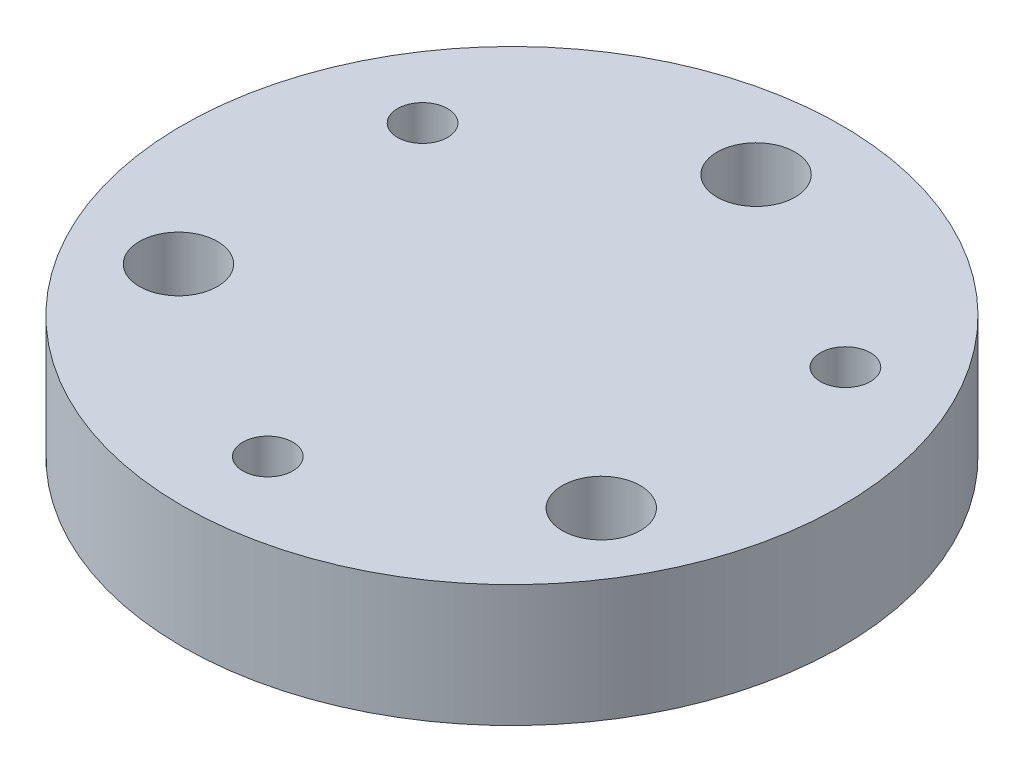
ISO-10303-21;
HEADER;
FILE_DESCRIPTION(('STEP AP214'),'2;1');
FILE_NAME('part.step','',(''),(''),'','','');
FILE_SCHEMA(('AUTOMOTIVE_DESIGN { 1 0 10303 214 1 1 1 1 }'));
ENDSEC;
DATA;
#1=APPLICATION_CONTEXT('core data for automotive mechanical design processes');
#2=APPLICATION_PROTOCOL_DEFINITION('international standard','automotive_design',2000,#1);
#3=PRODUCT_CONTEXT('',#1,'mechanical');
#4=PRODUCT('Part','Part','',(#3));
#5=PRODUCT_RELATED_PRODUCT_CATEGORY('part','',(#4));
#6=PRODUCT_DEFINITION_FORMATION('','',#4);
#7=PRODUCT_DEFINITION_CONTEXT('part definition',#1,'design');
#8=PRODUCT_DEFINITION('design','',#6,#7);
#9=PRODUCT_DEFINITION_SHAPE('','',#8);
#10=(LENGTH_UNIT() NAMED_UNIT(*) SI_UNIT(.MILLI.,.METRE.));
#11=(NAMED_UNIT(*) PLANE_ANGLE_UNIT() SI_UNIT($,.RADIAN.));
#12=(NAMED_UNIT(*) SI_UNIT($,.STERADIAN.) SOLID_ANGLE_UNIT());
#13=UNCERTAINTY_MEASURE_WITH_UNIT(LENGTH_MEASURE(1.E-05),#10,'distance_accuracy_value','');
#14=(GEOMETRIC_REPRESENTATION_CONTEXT(3) GLOBAL_UNCERTAINTY_ASSIGNED_CONTEXT((#13)) GLOBAL_UNIT_ASSIGNED_CONTEXT((#10,
#11,#12)) REPRESENTATION_CONTEXT('',''));
#15=CARTESIAN_POINT('',(0.,0.,0.));
#16=DIRECTION('',(0.,0.,1.));
#17=DIRECTION('',(1.,0.,0.));
#18=AXIS2_PLACEMENT_3D('',#15,#16,#17);
#19=CARTESIAN_POINT('',(0.,5.,0.));
#20=DIRECTION('',(0.,1.,0.));
#21=DIRECTION('',(0.,0.,1.));
#22=AXIS2_PLACEMENT_3D('',#19,#20,#21);
#23=PLANE('',#22);
#24=CARTESIAN_POINT('',(0.,5.,10.));
#25=DIRECTION('',(0.,1.,0.));
#26=DIRECTION('',(0.,0.,1.));
#27=AXIS2_PLACEMENT_3D('',#24,#25,#26);
#28=CIRCLE('',#27,1.025);
#29=CARTESIAN_POINT('',(0.,5.,11.025));
#30=VERTEX_POINT('',#29);
#31=EDGE_CURVE('E73',#30,#30,#28,.T.);
#32=ORIENTED_EDGE('',*,*,#31,.F.);
#33=EDGE_LOOP('',(#32));
#34=FACE_BOUND('',#33,.T.);
#35=CARTESIAN_POINT('',(8.66025403784439,5.,5.));
#36=DIRECTION('',(0.,1.,0.));
#37=DIRECTION('',(0.,0.,1.));
#38=AXIS2_PLACEMENT_3D('',#35,#36,#37);
#39=CIRCLE('',#38,1.6);
#40=CARTESIAN_POINT('',(8.66025403784439,5.,6.6));
#41=VERTEX_POINT('',#40);
#42=EDGE_CURVE('E61',#41,#41,#39,.T.);
#43=ORIENTED_EDGE('',*,*,#42,.F.);
#44=EDGE_LOOP('',(#43));
#45=FACE_BOUND('',#44,.T.);
#46=CARTESIAN_POINT('',(0.,5.,-10.));
#47=DIRECTION('',(0.,1.,0.));
#48=DIRECTION('',(0.,0.,1.));
#49=AXIS2_PLACEMENT_3D('',#46,#47,#48);
#50=CIRCLE('',#49,1.6);
#51=CARTESIAN_POINT('',(0.,5.,-8.4));
#52=VERTEX_POINT('',#51);
#53=EDGE_CURVE('E50',#52,#52,#50,.T.);
#54=ORIENTED_EDGE('',*,*,#53,.F.);
#55=EDGE_LOOP('',(#54));
#56=FACE_BOUND('',#55,.T.);
#57=CARTESIAN_POINT('',(0.,5.,0.));
#58=DIRECTION('',(0.,1.,0.));
#59=DIRECTION('',(0.,0.,1.));
#60=AXIS2_PLACEMENT_3D('',#57,#58,#59);
#61=CIRCLE('',#60,13.5);
#62=CARTESIAN_POINT('',(0.,5.,13.5));
#63=VERTEX_POINT('',#62);
#64=EDGE_CURVE('E10',#63,#63,#61,.T.);
#65=ORIENTED_EDGE('',*,*,#64,.T.);
#66=EDGE_LOOP('',(#65));
#67=FACE_BOUND('',#66,.T.);
#68=CARTESIAN_POINT('',(8.66025403784436,5.,-5.00000000000004));
#69=DIRECTION('',(0.,1.,0.));
#70=DIRECTION('',(0.,0.,1.));
#71=AXIS2_PLACEMENT_3D('',#68,#69,#70);
#72=CIRCLE('',#71,1.025);
#73=CARTESIAN_POINT('',(8.66025403784436,5.,-3.97500000000004));
#74=VERTEX_POINT('',#73);
#75=EDGE_CURVE('E55',#74,#74,#72,.T.);
#76=ORIENTED_EDGE('',*,*,#75,.F.);
#77=EDGE_LOOP('',(#76));
#78=FACE_BOUND('',#77,.T.);
#79=CARTESIAN_POINT('',(-8.66025403784439,5.,5.));
#80=DIRECTION('',(0.,1.,0.));
#81=DIRECTION('',(0.,0.,1.));
#82=AXIS2_PLACEMENT_3D('',#79,#80,#81);
#83=CIRCLE('',#82,1.6);
#84=CARTESIAN_POINT('',(-8.66025403784439,5.,6.6));
#85=VERTEX_POINT('',#84);
#86=EDGE_CURVE('E67',#85,#85,#83,.T.);
#87=ORIENTED_EDGE('',*,*,#86,.F.);
#88=EDGE_LOOP('',(#87));
#89=FACE_BOUND('',#88,.T.);
#90=CARTESIAN_POINT('',(-8.66025403784441,5.,-4.99999999999996));
#91=DIRECTION('',(0.,1.,0.));
#92=DIRECTION('',(0.,0.,1.));
#93=AXIS2_PLACEMENT_3D('',#90,#91,#92);
#94=CIRCLE('',#93,1.025);
#95=CARTESIAN_POINT('',(-8.66025403784441,5.,-3.97499999999996));
#96=VERTEX_POINT('',#95);
#97=EDGE_CURVE('E79',#96,#96,#94,.T.);
#98=ORIENTED_EDGE('',*,*,#97,.F.);
#99=EDGE_LOOP('',(#98));
#100=FACE_BOUND('',#99,.T.);
#101=ADVANCED_FACE('F39',(#34,#45,#56,#67,#78,#89,#100),#23,.T.);
#102=CARTESIAN_POINT('',(0.,0.,0.));
#103=DIRECTION('',(0.,1.,0.));
#104=DIRECTION('',(0.,0.,1.));
#105=AXIS2_PLACEMENT_3D('',#102,#103,#104);
#106=PLANE('',#105);
#107=CARTESIAN_POINT('',(0.,0.,0.));
#108=DIRECTION('',(0.,1.,0.));
#109=DIRECTION('',(0.,0.,1.));
#110=AXIS2_PLACEMENT_3D('',#107,#108,#109);
#111=CIRCLE('',#110,13.5);
#112=CARTESIAN_POINT('',(0.,0.,13.5));
#113=VERTEX_POINT('',#112);
#114=EDGE_CURVE('E43',#113,#113,#111,.T.);
#115=ORIENTED_EDGE('',*,*,#114,.F.);
#116=EDGE_LOOP('',(#115));
#117=FACE_BOUND('',#116,.T.);
#118=CARTESIAN_POINT('',(0.,0.,-10.));
#119=DIRECTION('',(0.,1.,0.));
#120=DIRECTION('',(0.,0.,1.));
#121=AXIS2_PLACEMENT_3D('',#118,#119,#120);
#122=CIRCLE('',#121,1.6);
#123=CARTESIAN_POINT('',(0.,0.,-8.4));
#124=VERTEX_POINT('',#123);
#125=EDGE_CURVE('E52',#124,#124,#122,.T.);
#126=ORIENTED_EDGE('',*,*,#125,.T.);
#127=EDGE_LOOP('',(#126));
#128=FACE_BOUND('',#127,.T.);
#129=CARTESIAN_POINT('',(8.66025403784436,0.,-5.00000000000004));
#130=DIRECTION('',(0.,1.,0.));
#131=DIRECTION('',(0.,0.,1.));
#132=AXIS2_PLACEMENT_3D('',#129,#130,#131);
#133=CIRCLE('',#132,1.025);
#134=CARTESIAN_POINT('',(8.66025403784436,0.,-3.97500000000004));
#135=VERTEX_POINT('',#134);
#136=EDGE_CURVE('E58',#135,#135,#133,.T.);
#137=ORIENTED_EDGE('',*,*,#136,.T.);
#138=EDGE_LOOP('',(#137));
#139=FACE_BOUND('',#138,.T.);
#140=CARTESIAN_POINT('',(8.66025403784439,0.,5.));
#141=DIRECTION('',(0.,1.,0.));
#142=DIRECTION('',(0.,0.,1.));
#143=AXIS2_PLACEMENT_3D('',#140,#141,#142);
#144=CIRCLE('',#143,1.6);
#145=CARTESIAN_POINT('',(8.66025403784439,0.,6.6));
#146=VERTEX_POINT('',#145);
#147=EDGE_CURVE('E64',#146,#146,#144,.T.);
#148=ORIENTED_EDGE('',*,*,#147,.T.);
#149=EDGE_LOOP('',(#148));
#150=FACE_BOUND('',#149,.T.);
#151=CARTESIAN_POINT('',(-8.66025403784439,0.,5.));
#152=DIRECTION('',(0.,1.,0.));
#153=DIRECTION('',(0.,0.,1.));
#154=AXIS2_PLACEMENT_3D('',#151,#152,#153);
#155=CIRCLE('',#154,1.6);
#156=CARTESIAN_POINT('',(-8.66025403784439,0.,6.6));
#157=VERTEX_POINT('',#156);
#158=EDGE_CURVE('E70',#157,#157,#155,.T.);
#159=ORIENTED_EDGE('',*,*,#158,.T.);
#160=EDGE_LOOP('',(#159));
#161=FACE_BOUND('',#160,.T.);
#162=CARTESIAN_POINT('',(0.,0.,10.));
#163=DIRECTION('',(0.,1.,0.));
#164=DIRECTION('',(0.,0.,1.));
#165=AXIS2_PLACEMENT_3D('',#162,#163,#164);
#166=CIRCLE('',#165,1.025);
#167=CARTESIAN_POINT('',(0.,0.,11.025));
#168=VERTEX_POINT('',#167);
#169=EDGE_CURVE('E76',#168,#168,#166,.T.);
#170=ORIENTED_EDGE('',*,*,#169,.T.);
#171=EDGE_LOOP('',(#170));
#172=FACE_BOUND('',#171,.T.);
#173=CARTESIAN_POINT('',(-8.66025403784441,0.,-4.99999999999996));
#174=DIRECTION('',(0.,1.,0.));
#175=DIRECTION('',(0.,0.,1.));
#176=AXIS2_PLACEMENT_3D('',#173,#174,#175);
#177=CIRCLE('',#176,1.025);
#178=CARTESIAN_POINT('',(-8.66025403784441,0.,-3.97499999999996));
#179=VERTEX_POINT('',#178);
#180=EDGE_CURVE('E82',#179,#179,#177,.T.);
#181=ORIENTED_EDGE('',*,*,#180,.T.);
#182=EDGE_LOOP('',(#181));
#183=FACE_BOUND('',#182,.T.);
#184=ADVANCED_FACE('F92',(#117,#128,#139,#150,#161,#172,#183),#106,.F.);
#185=CARTESIAN_POINT('',(0.,5.,0.));
#186=DIRECTION('',(0.,-1.,0.));
#187=DIRECTION('',(0.,0.,-1.));
#188=AXIS2_PLACEMENT_3D('',#185,#186,#187);
#189=CYLINDRICAL_SURFACE('',#188,13.5);
#190=ORIENTED_EDGE('',*,*,#64,.F.);
#191=EDGE_LOOP('',(#190));
#192=FACE_BOUND('',#191,.T.);
#193=ORIENTED_EDGE('',*,*,#114,.T.);
#194=EDGE_LOOP('',(#193));
#195=FACE_BOUND('',#194,.T.);
#196=ADVANCED_FACE('F41',(#192,#195),#189,.T.);
#197=CARTESIAN_POINT('',(0.,5.,-10.));
#198=DIRECTION('',(0.,-1.,0.));
#199=DIRECTION('',(0.,0.,-1.));
#200=AXIS2_PLACEMENT_3D('',#197,#198,#199);
#201=CYLINDRICAL_SURFACE('',#200,1.6);
#202=ORIENTED_EDGE('',*,*,#53,.T.);
#203=EDGE_LOOP('',(#202));
#204=FACE_BOUND('',#203,.T.);
#205=ORIENTED_EDGE('',*,*,#125,.F.);
#206=EDGE_LOOP('',(#205));
#207=FACE_BOUND('',#206,.T.);
#208=ADVANCED_FACE('F102',(#204,#207),#201,.F.);
#209=CARTESIAN_POINT('',(8.66025403784436,5.,-5.00000000000004));
#210=DIRECTION('',(0.,-1.,0.));
#211=DIRECTION('',(0.,0.,-1.));
#212=AXIS2_PLACEMENT_3D('',#209,#210,#211);
#213=CYLINDRICAL_SURFACE('',#212,1.025);
#214=ORIENTED_EDGE('',*,*,#75,.T.);
#215=EDGE_LOOP('',(#214));
#216=FACE_BOUND('',#215,.T.);
#217=ORIENTED_EDGE('',*,*,#136,.F.);
#218=EDGE_LOOP('',(#217));
#219=FACE_BOUND('',#218,.T.);
#220=ADVANCED_FACE('F105',(#216,#219),#213,.F.);
#221=CARTESIAN_POINT('',(8.66025403784439,5.,5.));
#222=DIRECTION('',(0.,-1.,0.));
#223=DIRECTION('',(0.,0.,-1.));
#224=AXIS2_PLACEMENT_3D('',#221,#222,#223);
#225=CYLINDRICAL_SURFACE('',#224,1.6);
#226=ORIENTED_EDGE('',*,*,#42,.T.);
#227=EDGE_LOOP('',(#226));
#228=FACE_BOUND('',#227,.T.);
#229=ORIENTED_EDGE('',*,*,#147,.F.);
#230=EDGE_LOOP('',(#229));
#231=FACE_BOUND('',#230,.T.);
#232=ADVANCED_FACE('F109',(#228,#231),#225,.F.);
#233=CARTESIAN_POINT('',(-8.66025403784439,5.,5.));
#234=DIRECTION('',(0.,-1.,0.));
#235=DIRECTION('',(0.,0.,-1.));
#236=AXIS2_PLACEMENT_3D('',#233,#234,#235);
#237=CYLINDRICAL_SURFACE('',#236,1.6);
#238=ORIENTED_EDGE('',*,*,#86,.T.);
#239=EDGE_LOOP('',(#238));
#240=FACE_BOUND('',#239,.T.);
#241=ORIENTED_EDGE('',*,*,#158,.F.);
#242=EDGE_LOOP('',(#241));
#243=FACE_BOUND('',#242,.T.);
#244=ADVANCED_FACE('F113',(#240,#243),#237,.F.);
#245=CARTESIAN_POINT('',(0.,5.,10.));
#246=DIRECTION('',(0.,-1.,0.));
#247=DIRECTION('',(0.,0.,-1.));
#248=AXIS2_PLACEMENT_3D('',#245,#246,#247);
#249=CYLINDRICAL_SURFACE('',#248,1.025);
#250=ORIENTED_EDGE('',*,*,#31,.T.);
#251=EDGE_LOOP('',(#250));
#252=FACE_BOUND('',#251,.T.);
#253=ORIENTED_EDGE('',*,*,#169,.F.);
#254=EDGE_LOOP('',(#253));
#255=FACE_BOUND('',#254,.T.);
#256=ADVANCED_FACE('F117',(#252,#255),#249,.F.);
#257=CARTESIAN_POINT('',(-8.66025403784441,5.,-4.99999999999996));
#258=DIRECTION('',(0.,-1.,0.));
#259=DIRECTION('',(0.,0.,-1.));
#260=AXIS2_PLACEMENT_3D('',#257,#258,#259);
#261=CYLINDRICAL_SURFACE('',#260,1.025);
#262=ORIENTED_EDGE('',*,*,#97,.T.);
#263=EDGE_LOOP('',(#262));
#264=FACE_BOUND('',#263,.T.);
#265=ORIENTED_EDGE('',*,*,#180,.F.);
#266=EDGE_LOOP('',(#265));
#267=FACE_BOUND('',#266,.T.);
#268=ADVANCED_FACE('F88',(#264,#267),#261,.F.);
#269=CLOSED_SHELL('',(#101,#184,#196,#208,#220,#232,#244,#256,#268));
#270=MANIFOLD_SOLID_BREP('B2',#269);
#271=ADVANCED_BREP_SHAPE_REPRESENTATION('',(#18,#270),#14);
#272=SHAPE_DEFINITION_REPRESENTATION(#9,#271);
ENDSEC;
END-ISO-10303-21;
